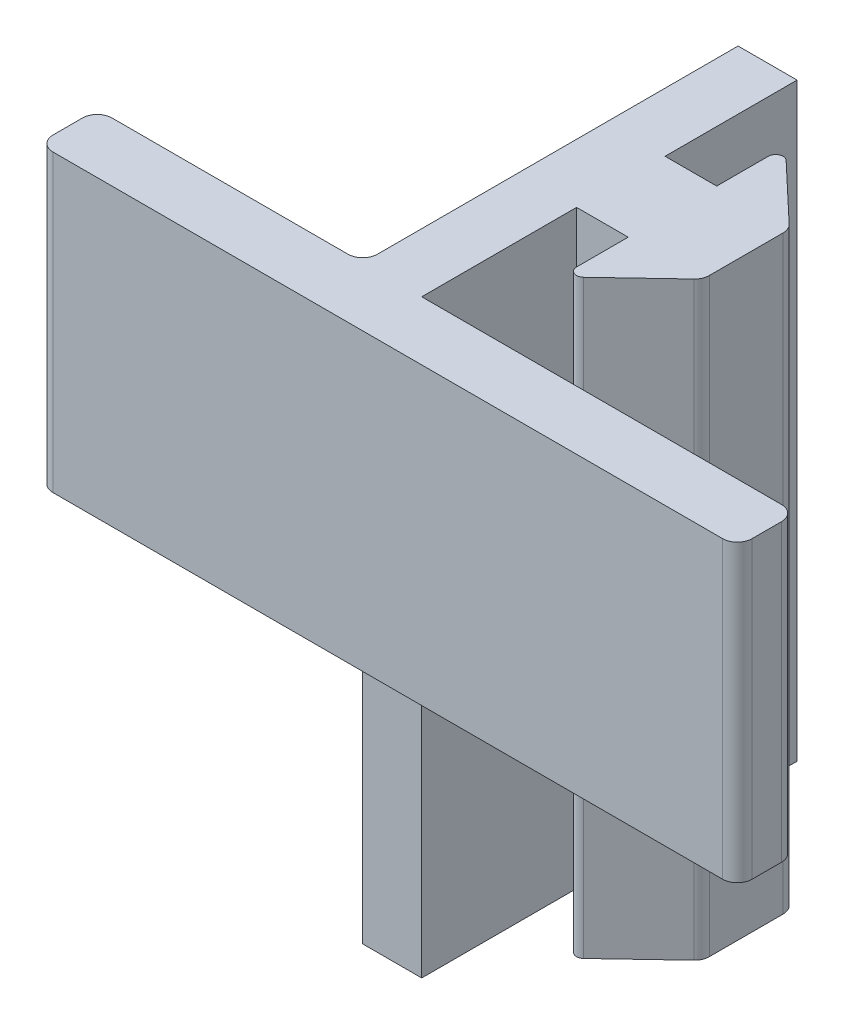
ISO-10303-21;
HEADER;
FILE_DESCRIPTION(('STEP AP214'),'2;1');
FILE_NAME('part.step','',(''),(''),'','','');
FILE_SCHEMA(('AUTOMOTIVE_DESIGN { 1 0 10303 214 1 1 1 1 }'));
ENDSEC;
DATA;
#1=APPLICATION_CONTEXT('core data for automotive mechanical design processes');
#2=APPLICATION_PROTOCOL_DEFINITION('international standard','automotive_design',2000,#1);
#3=PRODUCT_CONTEXT('',#1,'mechanical');
#4=PRODUCT('Part','Part','',(#3));
#5=PRODUCT_RELATED_PRODUCT_CATEGORY('part','',(#4));
#6=PRODUCT_DEFINITION_FORMATION('','',#4);
#7=PRODUCT_DEFINITION_CONTEXT('part definition',#1,'design');
#8=PRODUCT_DEFINITION('design','',#6,#7);
#9=PRODUCT_DEFINITION_SHAPE('','',#8);
#10=(LENGTH_UNIT() NAMED_UNIT(*) SI_UNIT(.MILLI.,.METRE.));
#11=(NAMED_UNIT(*) PLANE_ANGLE_UNIT() SI_UNIT($,.RADIAN.));
#12=(NAMED_UNIT(*) SI_UNIT($,.STERADIAN.) SOLID_ANGLE_UNIT());
#13=UNCERTAINTY_MEASURE_WITH_UNIT(LENGTH_MEASURE(1.E-05),#10,'distance_accuracy_value','');
#14=(GEOMETRIC_REPRESENTATION_CONTEXT(3) GLOBAL_UNCERTAINTY_ASSIGNED_CONTEXT((#13)) GLOBAL_UNIT_ASSIGNED_CONTEXT((#10,
#11,#12)) REPRESENTATION_CONTEXT('',''));
#15=CARTESIAN_POINT('',(0.,0.,0.));
#16=DIRECTION('',(0.,0.,1.));
#17=DIRECTION('',(1.,0.,0.));
#18=AXIS2_PLACEMENT_3D('',#15,#16,#17);
#19=CARTESIAN_POINT('',(28.4,40.,-0.659541062801933));
#20=DIRECTION('',(-1.,0.,0.));
#21=DIRECTION('',(0.,0.,1.));
#22=AXIS2_PLACEMENT_3D('',#19,#20,#21);
#23=PLANE('',#22);
#24=DIRECTION('',(0.,0.,1.));
#25=VECTOR('',#24,1.);
#26=CARTESIAN_POINT('',(28.4,20.,-0.659541062801928));
#27=LINE('',#26,#25);
#28=CARTESIAN_POINT('',(28.4,20.,0.340458937198067));
#29=VERTEX_POINT('',#28);
#30=CARTESIAN_POINT('',(28.4,20.,2.34045893719807));
#31=VERTEX_POINT('',#30);
#32=EDGE_CURVE('E238',#29,#31,#27,.T.);
#33=ORIENTED_EDGE('',*,*,#32,.F.);
#34=DIRECTION('',(0.,-1.,0.));
#35=VECTOR('',#34,1.);
#36=CARTESIAN_POINT('',(28.4,40.,0.340458937198068));
#37=LINE('',#36,#35);
#38=CARTESIAN_POINT('',(28.4,40.,0.340458937198068));
#39=VERTEX_POINT('',#38);
#40=EDGE_CURVE('E468',#29,#39,#37,.F.);
#41=ORIENTED_EDGE('',*,*,#40,.T.);
#42=DIRECTION('',(0.,0.,-1.));
#43=VECTOR('',#42,1.);
#44=CARTESIAN_POINT('',(28.4,40.,-0.659541062801933));
#45=LINE('',#44,#43);
#46=CARTESIAN_POINT('',(28.4,40.,2.34045893719807));
#47=VERTEX_POINT('',#46);
#48=EDGE_CURVE('E275',#47,#39,#45,.T.);
#49=ORIENTED_EDGE('',*,*,#48,.F.);
#50=DIRECTION('',(0.,-1.,0.));
#51=VECTOR('',#50,1.);
#52=CARTESIAN_POINT('',(28.4,40.,2.34045893719807));
#53=LINE('',#52,#51);
#54=EDGE_CURVE('E464',#47,#31,#53,.T.);
#55=ORIENTED_EDGE('',*,*,#54,.T.);
#56=EDGE_LOOP('',(#33,#41,#49,#55));
#57=FACE_BOUND('',#56,.T.);
#58=ADVANCED_FACE('F39',(#57),#23,.F.);
#59=CARTESIAN_POINT('',(3.,40.,-0.659541062801933));
#60=DIRECTION('',(0.,0.,1.));
#61=DIRECTION('',(1.,0.,0.));
#62=AXIS2_PLACEMENT_3D('',#59,#60,#61);
#63=PLANE('',#62);
#64=DIRECTION('',(1.,0.,0.));
#65=VECTOR('',#64,1.);
#66=CARTESIAN_POINT('',(3.,20.,-0.659541062801933));
#67=LINE('',#66,#65);
#68=CARTESIAN_POINT('',(3.,20.,-0.659541062801928));
#69=VERTEX_POINT('',#68);
#70=CARTESIAN_POINT('',(27.4,20.,-0.659541062801928));
#71=VERTEX_POINT('',#70);
#72=EDGE_CURVE('E271',#69,#71,#67,.T.);
#73=ORIENTED_EDGE('',*,*,#72,.F.);
#74=DIRECTION('',(0.,-1.,0.));
#75=VECTOR('',#74,1.);
#76=CARTESIAN_POINT('',(3.,40.,-0.659541062801933));
#77=LINE('',#76,#75);
#78=CARTESIAN_POINT('',(3.,40.,-0.659541062801933));
#79=VERTEX_POINT('',#78);
#80=EDGE_CURVE('E437',#79,#69,#77,.T.);
#81=ORIENTED_EDGE('',*,*,#80,.F.);
#82=DIRECTION('',(-1.,0.,0.));
#83=VECTOR('',#82,1.);
#84=CARTESIAN_POINT('',(3.,40.,-0.659541062801933));
#85=LINE('',#84,#83);
#86=CARTESIAN_POINT('',(27.4,40.,-0.659541062801933));
#87=VERTEX_POINT('',#86);
#88=EDGE_CURVE('E279',#87,#79,#85,.T.);
#89=ORIENTED_EDGE('',*,*,#88,.F.);
#90=DIRECTION('',(0.,-1.,0.));
#91=VECTOR('',#90,1.);
#92=CARTESIAN_POINT('',(27.4,40.,-0.659541062801933));
#93=LINE('',#92,#91);
#94=EDGE_CURVE('E460',#87,#71,#93,.T.);
#95=ORIENTED_EDGE('',*,*,#94,.T.);
#96=EDGE_LOOP('',(#73,#81,#89,#95));
#97=FACE_BOUND('',#96,.T.);
#98=ADVANCED_FACE('F510',(#97),#63,.F.);
#99=CARTESIAN_POINT('',(-1.,40.,-0.65954106280193));
#100=DIRECTION('',(0.,0.,1.));
#101=DIRECTION('',(1.,0.,0.));
#102=AXIS2_PLACEMENT_3D('',#99,#100,#101);
#103=PLANE('',#102);
#104=DIRECTION('',(1.,0.,0.));
#105=VECTOR('',#104,1.);
#106=CARTESIAN_POINT('',(-19.,20.,-0.659541062801928));
#107=LINE('',#106,#105);
#108=CARTESIAN_POINT('',(-18.,20.,-0.659541062801928));
#109=VERTEX_POINT('',#108);
#110=CARTESIAN_POINT('',(-2.,20.,-0.659541062801929));
#111=VERTEX_POINT('',#110);
#112=EDGE_CURVE('E54',#109,#111,#107,.T.);
#113=ORIENTED_EDGE('',*,*,#112,.F.);
#114=DIRECTION('',(0.,-1.,0.));
#115=VECTOR('',#114,1.);
#116=CARTESIAN_POINT('',(-18.,40.,-0.659541062801928));
#117=LINE('',#116,#115);
#118=CARTESIAN_POINT('',(-18.,40.,-0.659541062801928));
#119=VERTEX_POINT('',#118);
#120=EDGE_CURVE('E475',#109,#119,#117,.F.);
#121=ORIENTED_EDGE('',*,*,#120,.T.);
#122=DIRECTION('',(-1.,0.,0.));
#123=VECTOR('',#122,1.);
#124=CARTESIAN_POINT('',(-1.,40.,-0.65954106280193));
#125=LINE('',#124,#123);
#126=CARTESIAN_POINT('',(-2.,40.,-0.65954106280193));
#127=VERTEX_POINT('',#126);
#128=EDGE_CURVE('E327',#127,#119,#125,.T.);
#129=ORIENTED_EDGE('',*,*,#128,.F.);
#130=DIRECTION('',(0.,-1.,0.));
#131=VECTOR('',#130,1.);
#132=CARTESIAN_POINT('',(-2.,0.,-0.659541062801929));
#133=LINE('',#132,#131);
#134=EDGE_CURVE('E481',#127,#111,#133,.T.);
#135=ORIENTED_EDGE('',*,*,#134,.T.);
#136=EDGE_LOOP('',(#113,#121,#129,#135));
#137=FACE_BOUND('',#136,.T.);
#138=ADVANCED_FACE('F495',(#137),#103,.F.);
#139=CARTESIAN_POINT('',(-19.,40.,-0.659541062801928));
#140=DIRECTION('',(1.,0.,0.));
#141=DIRECTION('',(0.,0.,-1.));
#142=AXIS2_PLACEMENT_3D('',#139,#140,#141);
#143=PLANE('',#142);
#144=DIRECTION('',(0.,0.,-1.));
#145=VECTOR('',#144,1.);
#146=CARTESIAN_POINT('',(-19.,20.,-0.659541062801928));
#147=LINE('',#146,#145);
#148=CARTESIAN_POINT('',(-19.,20.,2.34045893719807));
#149=VERTEX_POINT('',#148);
#150=CARTESIAN_POINT('',(-19.,20.,0.340458937198072));
#151=VERTEX_POINT('',#150);
#152=EDGE_CURVE('E246',#149,#151,#147,.T.);
#153=ORIENTED_EDGE('',*,*,#152,.F.);
#154=DIRECTION('',(0.,-1.,0.));
#155=VECTOR('',#154,1.);
#156=CARTESIAN_POINT('',(-19.,40.,2.34045893719807));
#157=LINE('',#156,#155);
#158=CARTESIAN_POINT('',(-19.,40.,2.34045893719807));
#159=VERTEX_POINT('',#158);
#160=EDGE_CURVE('E448',#149,#159,#157,.F.);
#161=ORIENTED_EDGE('',*,*,#160,.T.);
#162=DIRECTION('',(0.,0.,1.));
#163=VECTOR('',#162,1.);
#164=CARTESIAN_POINT('',(-19.,40.,-0.659541062801928));
#165=LINE('',#164,#163);
#166=CARTESIAN_POINT('',(-19.,40.,0.340458937198072));
#167=VERTEX_POINT('',#166);
#168=EDGE_CURVE('E331',#167,#159,#165,.T.);
#169=ORIENTED_EDGE('',*,*,#168,.F.);
#170=DIRECTION('',(0.,-1.,0.));
#171=VECTOR('',#170,1.);
#172=CARTESIAN_POINT('',(-19.,40.,0.340458937198072));
#173=LINE('',#172,#171);
#174=EDGE_CURVE('E471',#167,#151,#173,.T.);
#175=ORIENTED_EDGE('',*,*,#174,.T.);
#176=EDGE_LOOP('',(#153,#161,#169,#175));
#177=FACE_BOUND('',#176,.T.);
#178=ADVANCED_FACE('F546',(#177),#143,.F.);
#179=CARTESIAN_POINT('',(-4.9999120167291,40.,3.34045893719807));
#180=DIRECTION('',(0.,0.,-1.));
#181=DIRECTION('',(-1.,0.,0.));
#182=AXIS2_PLACEMENT_3D('',#179,#180,#181);
#183=PLANE('',#182);
#184=DIRECTION('',(-1.,0.,0.));
#185=VECTOR('',#184,1.);
#186=CARTESIAN_POINT('',(-19.,20.,3.34045893719807));
#187=LINE('',#186,#185);
#188=CARTESIAN_POINT('',(27.4,20.,3.34045893719807));
#189=VERTEX_POINT('',#188);
#190=CARTESIAN_POINT('',(-18.,20.,3.34045893719807));
#191=VERTEX_POINT('',#190);
#192=EDGE_CURVE('E241',#189,#191,#187,.T.);
#193=ORIENTED_EDGE('',*,*,#192,.F.);
#194=DIRECTION('',(0.,-1.,0.));
#195=VECTOR('',#194,1.);
#196=CARTESIAN_POINT('',(27.4,40.,3.34045893719807));
#197=LINE('',#196,#195);
#198=CARTESIAN_POINT('',(27.4,40.,3.34045893719806));
#199=VERTEX_POINT('',#198);
#200=EDGE_CURVE('E441',#189,#199,#197,.F.);
#201=ORIENTED_EDGE('',*,*,#200,.T.);
#202=DIRECTION('',(1.,0.,0.));
#203=VECTOR('',#202,1.);
#204=CARTESIAN_POINT('',(-4.9999120167291,40.,3.34045893719807));
#205=LINE('',#204,#203);
#206=CARTESIAN_POINT('',(-18.,40.,3.34045893719807));
#207=VERTEX_POINT('',#206);
#208=EDGE_CURVE('E335',#207,#199,#205,.T.);
#209=ORIENTED_EDGE('',*,*,#208,.F.);
#210=DIRECTION('',(0.,-1.,0.));
#211=VECTOR('',#210,1.);
#212=CARTESIAN_POINT('',(-18.,40.,3.34045893719807));
#213=LINE('',#212,#211);
#214=EDGE_CURVE('E444',#207,#191,#213,.T.);
#215=ORIENTED_EDGE('',*,*,#214,.T.);
#216=EDGE_LOOP('',(#193,#201,#209,#215));
#217=FACE_BOUND('',#216,.T.);
#218=ADVANCED_FACE('F524',(#217),#183,.F.);
#219=CARTESIAN_POINT('',(-18.,40.,2.34045893719807));
#220=DIRECTION('',(0.,-1.,0.));
#221=DIRECTION('',(0.,0.,-1.));
#222=AXIS2_PLACEMENT_3D('',#219,#220,#221);
#223=CYLINDRICAL_SURFACE('',#222,1.);
#224=ORIENTED_EDGE('',*,*,#160,.F.);
#225=CARTESIAN_POINT('',(-18.,20.,2.34045893719807));
#226=DIRECTION('',(0.,-1.,0.));
#227=DIRECTION('',(0.,0.,-1.));
#228=AXIS2_PLACEMENT_3D('',#225,#226,#227);
#229=CIRCLE('',#228,1.);
#230=EDGE_CURVE('E267',#149,#191,#229,.F.);
#231=ORIENTED_EDGE('',*,*,#230,.T.);
#232=ORIENTED_EDGE('',*,*,#214,.F.);
#233=CARTESIAN_POINT('',(-18.,40.,2.34045893719807));
#234=DIRECTION('',(0.,1.,0.));
#235=DIRECTION('',(0.,0.,1.));
#236=AXIS2_PLACEMENT_3D('',#233,#234,#235);
#237=CIRCLE('',#236,1.);
#238=EDGE_CURVE('E457',#159,#207,#237,.T.);
#239=ORIENTED_EDGE('',*,*,#238,.F.);
#240=EDGE_LOOP('',(#224,#231,#232,#239));
#241=FACE_BOUND('',#240,.T.);
#242=ADVANCED_FACE('F520',(#241),#223,.T.);
#243=CARTESIAN_POINT('',(27.4,40.,0.340458937198067));
#244=DIRECTION('',(0.,-1.,0.));
#245=DIRECTION('',(0.,0.,-1.));
#246=AXIS2_PLACEMENT_3D('',#243,#244,#245);
#247=CYLINDRICAL_SURFACE('',#246,1.);
#248=ORIENTED_EDGE('',*,*,#40,.F.);
#249=CARTESIAN_POINT('',(27.4,20.,0.340458937198067));
#250=DIRECTION('',(0.,-1.,0.));
#251=DIRECTION('',(0.,0.,-1.));
#252=AXIS2_PLACEMENT_3D('',#249,#250,#251);
#253=CIRCLE('',#252,1.);
#254=EDGE_CURVE('E263',#29,#71,#253,.F.);
#255=ORIENTED_EDGE('',*,*,#254,.T.);
#256=ORIENTED_EDGE('',*,*,#94,.F.);
#257=CARTESIAN_POINT('',(27.4,40.,0.340458937198067));
#258=DIRECTION('',(0.,1.,0.));
#259=DIRECTION('',(0.,0.,1.));
#260=AXIS2_PLACEMENT_3D('',#257,#258,#259);
#261=CIRCLE('',#260,1.);
#262=EDGE_CURVE('E454',#39,#87,#261,.T.);
#263=ORIENTED_EDGE('',*,*,#262,.F.);
#264=EDGE_LOOP('',(#248,#255,#256,#263));
#265=FACE_BOUND('',#264,.T.);
#266=ADVANCED_FACE('F523',(#265),#247,.T.);
#267=CARTESIAN_POINT('',(27.4,40.,2.34045893719807));
#268=DIRECTION('',(0.,-1.,0.));
#269=DIRECTION('',(0.,0.,-1.));
#270=AXIS2_PLACEMENT_3D('',#267,#268,#269);
#271=CYLINDRICAL_SURFACE('',#270,1.);
#272=ORIENTED_EDGE('',*,*,#200,.F.);
#273=CARTESIAN_POINT('',(27.4,20.,2.34045893719807));
#274=DIRECTION('',(0.,-1.,0.));
#275=DIRECTION('',(0.,0.,-1.));
#276=AXIS2_PLACEMENT_3D('',#273,#274,#275);
#277=CIRCLE('',#276,1.);
#278=EDGE_CURVE('E259',#189,#31,#277,.F.);
#279=ORIENTED_EDGE('',*,*,#278,.T.);
#280=ORIENTED_EDGE('',*,*,#54,.F.);
#281=CARTESIAN_POINT('',(27.4,40.,2.34045893719807));
#282=DIRECTION('',(0.,1.,0.));
#283=DIRECTION('',(0.,0.,1.));
#284=AXIS2_PLACEMENT_3D('',#281,#282,#283);
#285=CIRCLE('',#284,1.);
#286=EDGE_CURVE('E451',#199,#47,#285,.T.);
#287=ORIENTED_EDGE('',*,*,#286,.F.);
#288=EDGE_LOOP('',(#272,#279,#280,#287));
#289=FACE_BOUND('',#288,.T.);
#290=ADVANCED_FACE('F507',(#289),#271,.T.);
#291=CARTESIAN_POINT('',(-18.,40.,0.340458937198072));
#292=DIRECTION('',(0.,-1.,0.));
#293=DIRECTION('',(0.,0.,-1.));
#294=AXIS2_PLACEMENT_3D('',#291,#292,#293);
#295=CYLINDRICAL_SURFACE('',#294,1.);
#296=ORIENTED_EDGE('',*,*,#120,.F.);
#297=CARTESIAN_POINT('',(-18.,20.,0.340458937198072));
#298=DIRECTION('',(0.,-1.,0.));
#299=DIRECTION('',(0.,0.,-1.));
#300=AXIS2_PLACEMENT_3D('',#297,#298,#299);
#301=CIRCLE('',#300,1.);
#302=EDGE_CURVE('E254',#109,#151,#301,.F.);
#303=ORIENTED_EDGE('',*,*,#302,.T.);
#304=ORIENTED_EDGE('',*,*,#174,.F.);
#305=CARTESIAN_POINT('',(-18.,40.,0.340458937198072));
#306=DIRECTION('',(0.,1.,0.));
#307=DIRECTION('',(0.,0.,1.));
#308=AXIS2_PLACEMENT_3D('',#305,#306,#307);
#309=CIRCLE('',#308,1.);
#310=EDGE_CURVE('E478',#119,#167,#309,.T.);
#311=ORIENTED_EDGE('',*,*,#310,.F.);
#312=EDGE_LOOP('',(#296,#303,#304,#311));
#313=FACE_BOUND('',#312,.T.);
#314=ADVANCED_FACE('F499',(#313),#295,.T.);
#315=CARTESIAN_POINT('',(-2.,40.,-1.65954106280193));
#316=DIRECTION('',(0.,1.,0.));
#317=DIRECTION('',(0.,0.,1.));
#318=AXIS2_PLACEMENT_3D('',#315,#316,#317);
#319=CYLINDRICAL_SURFACE('',#318,1.);
#320=CARTESIAN_POINT('',(-2.,20.,-1.65954106280193));
#321=DIRECTION('',(0.,-1.,0.));
#322=DIRECTION('',(0.,0.,-1.));
#323=AXIS2_PLACEMENT_3D('',#320,#321,#322);
#324=CIRCLE('',#323,1.);
#325=CARTESIAN_POINT('',(-1.,20.,-1.65954106280193));
#326=VERTEX_POINT('',#325);
#327=EDGE_CURVE('E11',#111,#326,#324,.F.);
#328=ORIENTED_EDGE('',*,*,#327,.F.);
#329=ORIENTED_EDGE('',*,*,#134,.F.);
#330=CARTESIAN_POINT('',(-2.,40.,-1.65954106280193));
#331=DIRECTION('',(0.,1.,0.));
#332=DIRECTION('',(0.,0.,1.));
#333=AXIS2_PLACEMENT_3D('',#330,#331,#332);
#334=CIRCLE('',#333,1.);
#335=CARTESIAN_POINT('',(-1.,40.,-1.65954106280193));
#336=VERTEX_POINT('',#335);
#337=EDGE_CURVE('E48',#336,#127,#334,.F.);
#338=ORIENTED_EDGE('',*,*,#337,.F.);
#339=DIRECTION('',(0.,-1.,0.));
#340=VECTOR('',#339,1.);
#341=CARTESIAN_POINT('',(-1.,40.,-1.65954106280193));
#342=LINE('',#341,#340);
#343=EDGE_CURVE('E62',#326,#336,#342,.F.);
#344=ORIENTED_EDGE('',*,*,#343,.F.);
#345=EDGE_LOOP('',(#328,#329,#338,#344));
#346=FACE_BOUND('',#345,.T.);
#347=ADVANCED_FACE('F41',(#346),#319,.F.);
#348=CARTESIAN_POINT('',(3.,40.,-0.659541062801933));
#349=DIRECTION('',(-1.,0.,0.));
#350=DIRECTION('',(0.,0.,1.));
#351=AXIS2_PLACEMENT_3D('',#348,#349,#350);
#352=PLANE('',#351);
#353=DIRECTION('',(0.,0.,-1.));
#354=VECTOR('',#353,1.);
#355=CARTESIAN_POINT('',(3.,0.,-0.659541062801933));
#356=LINE('',#355,#354);
#357=CARTESIAN_POINT('',(3.,0.,-0.659541062801928));
#358=VERTEX_POINT('',#357);
#359=CARTESIAN_POINT('',(3.,0.,-11.1595410628019));
#360=VERTEX_POINT('',#359);
#361=EDGE_CURVE('E274',#358,#360,#356,.T.);
#362=ORIENTED_EDGE('',*,*,#361,.T.);
#363=DIRECTION('',(0.,-1.,0.));
#364=VECTOR('',#363,1.);
#365=CARTESIAN_POINT('',(3.,40.,-11.1595410628019));
#366=LINE('',#365,#364);
#367=CARTESIAN_POINT('',(3.,40.,-11.1595410628019));
#368=VERTEX_POINT('',#367);
#369=EDGE_CURVE('E433',#368,#360,#366,.T.);
#370=ORIENTED_EDGE('',*,*,#369,.F.);
#371=DIRECTION('',(0.,0.,-1.));
#372=VECTOR('',#371,1.);
#373=CARTESIAN_POINT('',(3.,40.,-0.659541062801933));
#374=LINE('',#373,#372);
#375=EDGE_CURVE('E282',#79,#368,#374,.T.);
#376=ORIENTED_EDGE('',*,*,#375,.F.);
#377=ORIENTED_EDGE('',*,*,#80,.T.);
#378=DIRECTION('',(0.,-1.,0.));
#379=VECTOR('',#378,1.);
#380=CARTESIAN_POINT('',(3.,20.,-0.659541062801928));
#381=LINE('',#380,#379);
#382=EDGE_CURVE('E233',#69,#358,#381,.T.);
#383=ORIENTED_EDGE('',*,*,#382,.T.);
#384=EDGE_LOOP('',(#362,#370,#376,#377,#383));
#385=FACE_BOUND('',#384,.T.);
#386=ADVANCED_FACE('F498',(#385),#352,.F.);
#387=CARTESIAN_POINT('',(3.,40.,-11.1595410628019));
#388=DIRECTION('',(0.,0.,-1.));
#389=DIRECTION('',(-1.,0.,0.));
#390=AXIS2_PLACEMENT_3D('',#387,#388,#389);
#391=PLANE('',#390);
#392=DIRECTION('',(1.,0.,0.));
#393=VECTOR('',#392,1.);
#394=CARTESIAN_POINT('',(3.,0.,-11.1595410628019));
#395=LINE('',#394,#393);
#396=CARTESIAN_POINT('',(6.5,0.,-11.1595410628019));
#397=VERTEX_POINT('',#396);
#398=EDGE_CURVE('E342',#360,#397,#395,.T.);
#399=ORIENTED_EDGE('',*,*,#398,.T.);
#400=DIRECTION('',(0.,-1.,0.));
#401=VECTOR('',#400,1.);
#402=CARTESIAN_POINT('',(6.5,40.,-11.1595410628019));
#403=LINE('',#402,#401);
#404=CARTESIAN_POINT('',(6.5,40.,-11.1595410628019));
#405=VERTEX_POINT('',#404);
#406=EDGE_CURVE('E429',#405,#397,#403,.T.);
#407=ORIENTED_EDGE('',*,*,#406,.F.);
#408=DIRECTION('',(1.,0.,0.));
#409=VECTOR('',#408,1.);
#410=CARTESIAN_POINT('',(3.,40.,-11.1595410628019));
#411=LINE('',#410,#409);
#412=EDGE_CURVE('E285',#368,#405,#411,.T.);
#413=ORIENTED_EDGE('',*,*,#412,.F.);
#414=ORIENTED_EDGE('',*,*,#369,.T.);
#415=EDGE_LOOP('',(#399,#407,#413,#414));
#416=FACE_BOUND('',#415,.T.);
#417=ADVANCED_FACE('F504',(#416),#391,.F.);
#418=CARTESIAN_POINT('',(6.5,40.,-11.1595410628019));
#419=DIRECTION('',(1.,0.,0.));
#420=DIRECTION('',(0.,0.,-1.));
#421=AXIS2_PLACEMENT_3D('',#418,#419,#420);
#422=PLANE('',#421);
#423=DIRECTION('',(0.,0.,1.));
#424=VECTOR('',#423,1.);
#425=CARTESIAN_POINT('',(6.5,0.,-11.1595410628019));
#426=LINE('',#425,#424);
#427=CARTESIAN_POINT('',(6.5,0.,-7.65954106280193));
#428=VERTEX_POINT('',#427);
#429=EDGE_CURVE('E345',#397,#428,#426,.T.);
#430=ORIENTED_EDGE('',*,*,#429,.T.);
#431=DIRECTION('',(0.,-1.,0.));
#432=VECTOR('',#431,1.);
#433=CARTESIAN_POINT('',(6.5,40.,-7.65954106280193));
#434=LINE('',#433,#432);
#435=CARTESIAN_POINT('',(6.5,40.,-7.65954106280193));
#436=VERTEX_POINT('',#435);
#437=EDGE_CURVE('E425',#436,#428,#434,.T.);
#438=ORIENTED_EDGE('',*,*,#437,.F.);
#439=DIRECTION('',(0.,0.,1.));
#440=VECTOR('',#439,1.);
#441=CARTESIAN_POINT('',(6.5,40.,-11.1595410628019));
#442=LINE('',#441,#440);
#443=EDGE_CURVE('E288',#405,#436,#442,.T.);
#444=ORIENTED_EDGE('',*,*,#443,.F.);
#445=ORIENTED_EDGE('',*,*,#406,.T.);
#446=EDGE_LOOP('',(#430,#438,#444,#445));
#447=FACE_BOUND('',#446,.T.);
#448=ADVANCED_FACE('F603',(#447),#422,.F.);
#449=CARTESIAN_POINT('',(7.,40.,-7.65954106280193));
#450=DIRECTION('',(0.,-1.,0.));
#451=DIRECTION('',(0.,0.,-1.));
#452=AXIS2_PLACEMENT_3D('',#449,#450,#451);
#453=CYLINDRICAL_SURFACE('',#452,0.499999999999999);
#454=CARTESIAN_POINT('',(7.,0.,-7.65954106280193));
#455=DIRECTION('',(0.,1.,0.));
#456=DIRECTION('',(0.,0.,1.));
#457=AXIS2_PLACEMENT_3D('',#454,#455,#456);
#458=CIRCLE('',#457,0.499999999999999);
#459=CARTESIAN_POINT('',(7.34364620333658,0.,-7.29635063488242));
#460=VERTEX_POINT('',#459);
#461=EDGE_CURVE('E348',#428,#460,#458,.T.);
#462=ORIENTED_EDGE('',*,*,#461,.T.);
#463=DIRECTION('',(0.,-1.,0.));
#464=VECTOR('',#463,1.);
#465=CARTESIAN_POINT('',(7.34364620333658,40.,-7.29635063488242));
#466=LINE('',#465,#464);
#467=CARTESIAN_POINT('',(7.34364620333658,40.,-7.29635063488242));
#468=VERTEX_POINT('',#467);
#469=EDGE_CURVE('E421',#468,#460,#466,.T.);
#470=ORIENTED_EDGE('',*,*,#469,.F.);
#471=CARTESIAN_POINT('',(7.,40.,-7.65954106280193));
#472=DIRECTION('',(0.,1.,0.));
#473=DIRECTION('',(0.,0.,1.));
#474=AXIS2_PLACEMENT_3D('',#471,#472,#473);
#475=CIRCLE('',#474,0.499999999999999);
#476=EDGE_CURVE('E291',#436,#468,#475,.T.);
#477=ORIENTED_EDGE('',*,*,#476,.F.);
#478=ORIENTED_EDGE('',*,*,#437,.T.);
#479=EDGE_LOOP('',(#462,#470,#477,#478));
#480=FACE_BOUND('',#479,.T.);
#481=ADVANCED_FACE('F599',(#480),#453,.T.);
#482=CARTESIAN_POINT('',(7.34364620333658,40.,-7.29635063488242));
#483=DIRECTION('',(-0.687292406673158,0.,-0.726380855839014));
#484=DIRECTION('',(-0.726380855839014,0.,0.687292406673158));
#485=AXIS2_PLACEMENT_3D('',#482,#483,#484);
#486=PLANE('',#485);
#487=DIRECTION('',(0.726380855839014,0.,-0.687292406673158));
#488=VECTOR('',#487,1.);
#489=CARTESIAN_POINT('',(7.34364620333658,0.,-7.29635063488242));
#490=LINE('',#489,#488);
#491=CARTESIAN_POINT('',(11.1872924066732,0.,-10.9331602069629));
#492=VERTEX_POINT('',#491);
#493=EDGE_CURVE('E351',#460,#492,#490,.T.);
#494=ORIENTED_EDGE('',*,*,#493,.T.);
#495=DIRECTION('',(0.,-1.,0.));
#496=VECTOR('',#495,1.);
#497=CARTESIAN_POINT('',(11.1872924066732,40.,-10.9331602069629));
#498=LINE('',#497,#496);
#499=CARTESIAN_POINT('',(11.1872924066732,40.,-10.9331602069629));
#500=VERTEX_POINT('',#499);
#501=EDGE_CURVE('E417',#500,#492,#498,.T.);
#502=ORIENTED_EDGE('',*,*,#501,.F.);
#503=DIRECTION('',(0.726380855839014,0.,-0.687292406673158));
#504=VECTOR('',#503,1.);
#505=CARTESIAN_POINT('',(7.34364620333658,40.,-7.29635063488242));
#506=LINE('',#505,#504);
#507=EDGE_CURVE('E294',#468,#500,#506,.T.);
#508=ORIENTED_EDGE('',*,*,#507,.F.);
#509=ORIENTED_EDGE('',*,*,#469,.T.);
#510=EDGE_LOOP('',(#494,#502,#508,#509));
#511=FACE_BOUND('',#510,.T.);
#512=ADVANCED_FACE('F595',(#511),#486,.F.);
#513=CARTESIAN_POINT('',(10.5,40.,-11.6595410628019));
#514=DIRECTION('',(0.,-1.,0.));
#515=DIRECTION('',(0.,0.,-1.));
#516=AXIS2_PLACEMENT_3D('',#513,#514,#515);
#517=CYLINDRICAL_SURFACE('',#516,0.999999999999999);
#518=CARTESIAN_POINT('',(10.5,0.,-11.6595410628019));
#519=DIRECTION('',(0.,1.,0.));
#520=DIRECTION('',(0.,0.,1.));
#521=AXIS2_PLACEMENT_3D('',#518,#519,#520);
#522=CIRCLE('',#521,0.999999999999999);
#523=CARTESIAN_POINT('',(11.5,0.,-11.6595410628019));
#524=VERTEX_POINT('',#523);
#525=EDGE_CURVE('E354',#492,#524,#522,.T.);
#526=ORIENTED_EDGE('',*,*,#525,.T.);
#527=DIRECTION('',(0.,-1.,0.));
#528=VECTOR('',#527,1.);
#529=CARTESIAN_POINT('',(11.5,40.,-11.6595410628019));
#530=LINE('',#529,#528);
#531=CARTESIAN_POINT('',(11.5,40.,-11.6595410628019));
#532=VERTEX_POINT('',#531);
#533=EDGE_CURVE('E413',#532,#524,#530,.T.);
#534=ORIENTED_EDGE('',*,*,#533,.F.);
#535=CARTESIAN_POINT('',(10.5,40.,-11.6595410628019));
#536=DIRECTION('',(0.,1.,0.));
#537=DIRECTION('',(0.,0.,1.));
#538=AXIS2_PLACEMENT_3D('',#535,#536,#537);
#539=CIRCLE('',#538,0.999999999999999);
#540=EDGE_CURVE('E297',#500,#532,#539,.T.);
#541=ORIENTED_EDGE('',*,*,#540,.F.);
#542=ORIENTED_EDGE('',*,*,#501,.T.);
#543=EDGE_LOOP('',(#526,#534,#541,#542));
#544=FACE_BOUND('',#543,.T.);
#545=ADVANCED_FACE('F591',(#544),#517,.T.);
#546=CARTESIAN_POINT('',(11.5,40.,-16.6595410628019));
#547=DIRECTION('',(-1.,0.,0.));
#548=DIRECTION('',(0.,0.,1.));
#549=AXIS2_PLACEMENT_3D('',#546,#547,#548);
#550=PLANE('',#549);
#551=DIRECTION('',(0.,0.,-1.));
#552=VECTOR('',#551,1.);
#553=CARTESIAN_POINT('',(11.5,0.,-16.6595410628019));
#554=LINE('',#553,#552);
#555=CARTESIAN_POINT('',(11.5,0.,-16.6595410628019));
#556=VERTEX_POINT('',#555);
#557=EDGE_CURVE('E357',#524,#556,#554,.T.);
#558=ORIENTED_EDGE('',*,*,#557,.T.);
#559=DIRECTION('',(0.,-1.,0.));
#560=VECTOR('',#559,1.);
#561=CARTESIAN_POINT('',(11.5,40.,-16.6595410628019));
#562=LINE('',#561,#560);
#563=CARTESIAN_POINT('',(11.5,40.,-16.6595410628019));
#564=VERTEX_POINT('',#563);
#565=EDGE_CURVE('E409',#564,#556,#562,.T.);
#566=ORIENTED_EDGE('',*,*,#565,.F.);
#567=DIRECTION('',(0.,0.,-1.));
#568=VECTOR('',#567,1.);
#569=CARTESIAN_POINT('',(11.5,40.,-16.6595410628019));
#570=LINE('',#569,#568);
#571=EDGE_CURVE('E300',#532,#564,#570,.T.);
#572=ORIENTED_EDGE('',*,*,#571,.F.);
#573=ORIENTED_EDGE('',*,*,#533,.T.);
#574=EDGE_LOOP('',(#558,#566,#572,#573));
#575=FACE_BOUND('',#574,.T.);
#576=ADVANCED_FACE('F587',(#575),#550,.F.);
#577=CARTESIAN_POINT('',(10.5,40.,-16.6595410628019));
#578=DIRECTION('',(0.,-1.,0.));
#579=DIRECTION('',(0.,0.,-1.));
#580=AXIS2_PLACEMENT_3D('',#577,#578,#579);
#581=CYLINDRICAL_SURFACE('',#580,1.);
#582=CARTESIAN_POINT('',(10.5,0.,-16.6595410628019));
#583=DIRECTION('',(0.,1.,0.));
#584=DIRECTION('',(0.,0.,-1.));
#585=AXIS2_PLACEMENT_3D('',#582,#583,#584);
#586=CIRCLE('',#585,1.);
#587=CARTESIAN_POINT('',(11.1872924066732,0.,-17.3859219186409));
#588=VERTEX_POINT('',#587);
#589=EDGE_CURVE('E360',#556,#588,#586,.T.);
#590=ORIENTED_EDGE('',*,*,#589,.T.);
#591=DIRECTION('',(0.,-1.,0.));
#592=VECTOR('',#591,1.);
#593=CARTESIAN_POINT('',(11.1872924066732,40.,-17.3859219186409));
#594=LINE('',#593,#592);
#595=CARTESIAN_POINT('',(11.1872924066732,40.,-17.3859219186409));
#596=VERTEX_POINT('',#595);
#597=EDGE_CURVE('E405',#596,#588,#594,.T.);
#598=ORIENTED_EDGE('',*,*,#597,.F.);
#599=CARTESIAN_POINT('',(10.5,40.,-16.6595410628019));
#600=DIRECTION('',(0.,1.,0.));
#601=DIRECTION('',(0.,0.,-1.));
#602=AXIS2_PLACEMENT_3D('',#599,#600,#601);
#603=CIRCLE('',#602,1.);
#604=EDGE_CURVE('E303',#564,#596,#603,.T.);
#605=ORIENTED_EDGE('',*,*,#604,.F.);
#606=ORIENTED_EDGE('',*,*,#565,.T.);
#607=EDGE_LOOP('',(#590,#598,#605,#606));
#608=FACE_BOUND('',#607,.T.);
#609=ADVANCED_FACE('F583',(#608),#581,.T.);
#610=CARTESIAN_POINT('',(7.34364620333657,40.,-21.0227314907214));
#611=DIRECTION('',(-0.687292406673158,0.,0.726380855839014));
#612=DIRECTION('',(0.726380855839014,0.,0.687292406673158));
#613=AXIS2_PLACEMENT_3D('',#610,#611,#612);
#614=PLANE('',#613);
#615=DIRECTION('',(-0.726380855839014,0.,-0.687292406673158));
#616=VECTOR('',#615,1.);
#617=CARTESIAN_POINT('',(7.34364620333657,0.,-21.0227314907214));
#618=LINE('',#617,#616);
#619=CARTESIAN_POINT('',(7.34364620333657,0.,-21.0227314907214));
#620=VERTEX_POINT('',#619);
#621=EDGE_CURVE('E363',#588,#620,#618,.T.);
#622=ORIENTED_EDGE('',*,*,#621,.T.);
#623=DIRECTION('',(0.,-1.,0.));
#624=VECTOR('',#623,1.);
#625=CARTESIAN_POINT('',(7.34364620333657,40.,-21.0227314907214));
#626=LINE('',#625,#624);
#627=CARTESIAN_POINT('',(7.34364620333657,40.,-21.0227314907214));
#628=VERTEX_POINT('',#627);
#629=EDGE_CURVE('E401',#628,#620,#626,.T.);
#630=ORIENTED_EDGE('',*,*,#629,.F.);
#631=DIRECTION('',(-0.726380855839014,0.,-0.687292406673158));
#632=VECTOR('',#631,1.);
#633=CARTESIAN_POINT('',(7.34364620333657,40.,-21.0227314907214));
#634=LINE('',#633,#632);
#635=EDGE_CURVE('E306',#596,#628,#634,.T.);
#636=ORIENTED_EDGE('',*,*,#635,.F.);
#637=ORIENTED_EDGE('',*,*,#597,.T.);
#638=EDGE_LOOP('',(#622,#630,#636,#637));
#639=FACE_BOUND('',#638,.T.);
#640=ADVANCED_FACE('F579',(#639),#614,.F.);
#641=CARTESIAN_POINT('',(7.,40.,-20.6595410628019));
#642=DIRECTION('',(0.,-1.,0.));
#643=DIRECTION('',(0.,0.,-1.));
#644=AXIS2_PLACEMENT_3D('',#641,#642,#643);
#645=CYLINDRICAL_SURFACE('',#644,0.499999999999998);
#646=CARTESIAN_POINT('',(7.,0.,-20.6595410628019));
#647=DIRECTION('',(0.,1.,0.));
#648=DIRECTION('',(0.,0.,1.));
#649=AXIS2_PLACEMENT_3D('',#646,#647,#648);
#650=CIRCLE('',#649,0.499999999999998);
#651=CARTESIAN_POINT('',(6.5,0.,-20.6595410628019));
#652=VERTEX_POINT('',#651);
#653=EDGE_CURVE('E366',#620,#652,#650,.T.);
#654=ORIENTED_EDGE('',*,*,#653,.T.);
#655=DIRECTION('',(0.,-1.,0.));
#656=VECTOR('',#655,1.);
#657=CARTESIAN_POINT('',(6.5,40.,-20.6595410628019));
#658=LINE('',#657,#656);
#659=CARTESIAN_POINT('',(6.5,40.,-20.6595410628019));
#660=VERTEX_POINT('',#659);
#661=EDGE_CURVE('E397',#660,#652,#658,.T.);
#662=ORIENTED_EDGE('',*,*,#661,.F.);
#663=CARTESIAN_POINT('',(7.,40.,-20.6595410628019));
#664=DIRECTION('',(0.,1.,0.));
#665=DIRECTION('',(0.,0.,1.));
#666=AXIS2_PLACEMENT_3D('',#663,#664,#665);
#667=CIRCLE('',#666,0.499999999999998);
#668=EDGE_CURVE('E309',#628,#660,#667,.T.);
#669=ORIENTED_EDGE('',*,*,#668,.F.);
#670=ORIENTED_EDGE('',*,*,#629,.T.);
#671=EDGE_LOOP('',(#654,#662,#669,#670));
#672=FACE_BOUND('',#671,.T.);
#673=ADVANCED_FACE('F575',(#672),#645,.T.);
#674=CARTESIAN_POINT('',(6.5,40.,-20.6595410628019));
#675=DIRECTION('',(1.,0.,0.));
#676=DIRECTION('',(0.,0.,-1.));
#677=AXIS2_PLACEMENT_3D('',#674,#675,#676);
#678=PLANE('',#677);
#679=DIRECTION('',(0.,0.,1.));
#680=VECTOR('',#679,1.);
#681=CARTESIAN_POINT('',(6.5,0.,-20.6595410628019));
#682=LINE('',#681,#680);
#683=CARTESIAN_POINT('',(6.5,0.,-17.1595410628019));
#684=VERTEX_POINT('',#683);
#685=EDGE_CURVE('E369',#652,#684,#682,.T.);
#686=ORIENTED_EDGE('',*,*,#685,.T.);
#687=DIRECTION('',(0.,-1.,0.));
#688=VECTOR('',#687,1.);
#689=CARTESIAN_POINT('',(6.5,40.,-17.1595410628019));
#690=LINE('',#689,#688);
#691=CARTESIAN_POINT('',(6.5,40.,-17.1595410628019));
#692=VERTEX_POINT('',#691);
#693=EDGE_CURVE('E393',#692,#684,#690,.T.);
#694=ORIENTED_EDGE('',*,*,#693,.F.);
#695=DIRECTION('',(0.,0.,1.));
#696=VECTOR('',#695,1.);
#697=CARTESIAN_POINT('',(6.5,40.,-20.6595410628019));
#698=LINE('',#697,#696);
#699=EDGE_CURVE('E312',#660,#692,#698,.T.);
#700=ORIENTED_EDGE('',*,*,#699,.F.);
#701=ORIENTED_EDGE('',*,*,#661,.T.);
#702=EDGE_LOOP('',(#686,#694,#700,#701));
#703=FACE_BOUND('',#702,.T.);
#704=ADVANCED_FACE('F571',(#703),#678,.F.);
#705=CARTESIAN_POINT('',(3.,40.,-17.1595410628019));
#706=DIRECTION('',(0.,0.,1.));
#707=DIRECTION('',(1.,0.,0.));
#708=AXIS2_PLACEMENT_3D('',#705,#706,#707);
#709=PLANE('',#708);
#710=DIRECTION('',(-1.,0.,0.));
#711=VECTOR('',#710,1.);
#712=CARTESIAN_POINT('',(3.,0.,-17.1595410628019));
#713=LINE('',#712,#711);
#714=CARTESIAN_POINT('',(3.,0.,-17.1595410628019));
#715=VERTEX_POINT('',#714);
#716=EDGE_CURVE('E372',#684,#715,#713,.T.);
#717=ORIENTED_EDGE('',*,*,#716,.T.);
#718=DIRECTION('',(0.,-1.,0.));
#719=VECTOR('',#718,1.);
#720=CARTESIAN_POINT('',(3.,40.,-17.1595410628019));
#721=LINE('',#720,#719);
#722=CARTESIAN_POINT('',(3.,40.,-17.1595410628019));
#723=VERTEX_POINT('',#722);
#724=EDGE_CURVE('E389',#723,#715,#721,.T.);
#725=ORIENTED_EDGE('',*,*,#724,.F.);
#726=DIRECTION('',(-1.,0.,0.));
#727=VECTOR('',#726,1.);
#728=CARTESIAN_POINT('',(3.,40.,-17.1595410628019));
#729=LINE('',#728,#727);
#730=EDGE_CURVE('E315',#692,#723,#729,.T.);
#731=ORIENTED_EDGE('',*,*,#730,.F.);
#732=ORIENTED_EDGE('',*,*,#693,.T.);
#733=EDGE_LOOP('',(#717,#725,#731,#732));
#734=FACE_BOUND('',#733,.T.);
#735=ADVANCED_FACE('F567',(#734),#709,.F.);
#736=CARTESIAN_POINT('',(3.,40.,-17.1595410628019));
#737=DIRECTION('',(-1.,0.,0.));
#738=DIRECTION('',(0.,0.,1.));
#739=AXIS2_PLACEMENT_3D('',#736,#737,#738);
#740=PLANE('',#739);
#741=DIRECTION('',(0.,0.,-1.));
#742=VECTOR('',#741,1.);
#743=CARTESIAN_POINT('',(3.,0.,-17.1595410628019));
#744=LINE('',#743,#742);
#745=CARTESIAN_POINT('',(3.,0.,-26.1095410628019));
#746=VERTEX_POINT('',#745);
#747=EDGE_CURVE('E375',#715,#746,#744,.T.);
#748=ORIENTED_EDGE('',*,*,#747,.T.);
#749=DIRECTION('',(0.,-1.,0.));
#750=VECTOR('',#749,1.);
#751=CARTESIAN_POINT('',(3.,40.,-26.1095410628019));
#752=LINE('',#751,#750);
#753=CARTESIAN_POINT('',(3.,40.,-26.1095410628019));
#754=VERTEX_POINT('',#753);
#755=EDGE_CURVE('E385',#754,#746,#752,.T.);
#756=ORIENTED_EDGE('',*,*,#755,.F.);
#757=DIRECTION('',(0.,0.,-1.));
#758=VECTOR('',#757,1.);
#759=CARTESIAN_POINT('',(3.,40.,-17.1595410628019));
#760=LINE('',#759,#758);
#761=EDGE_CURVE('E318',#723,#754,#760,.T.);
#762=ORIENTED_EDGE('',*,*,#761,.F.);
#763=ORIENTED_EDGE('',*,*,#724,.T.);
#764=EDGE_LOOP('',(#748,#756,#762,#763));
#765=FACE_BOUND('',#764,.T.);
#766=ADVANCED_FACE('F563',(#765),#740,.F.);
#767=CARTESIAN_POINT('',(-1.,40.,-26.1095410628019));
#768=DIRECTION('',(0.,0.,1.));
#769=DIRECTION('',(1.,0.,0.));
#770=AXIS2_PLACEMENT_3D('',#767,#768,#769);
#771=PLANE('',#770);
#772=DIRECTION('',(-1.,0.,0.));
#773=VECTOR('',#772,1.);
#774=CARTESIAN_POINT('',(-1.,0.,-26.1095410628019));
#775=LINE('',#774,#773);
#776=CARTESIAN_POINT('',(-1.,0.,-26.1095410628019));
#777=VERTEX_POINT('',#776);
#778=EDGE_CURVE('E378',#746,#777,#775,.T.);
#779=ORIENTED_EDGE('',*,*,#778,.T.);
#780=DIRECTION('',(0.,-1.,0.));
#781=VECTOR('',#780,1.);
#782=CARTESIAN_POINT('',(-1.,40.,-26.1095410628019));
#783=LINE('',#782,#781);
#784=CARTESIAN_POINT('',(-1.,40.,-26.1095410628019));
#785=VERTEX_POINT('',#784);
#786=EDGE_CURVE('E339',#785,#777,#783,.T.);
#787=ORIENTED_EDGE('',*,*,#786,.F.);
#788=DIRECTION('',(-1.,0.,0.));
#789=VECTOR('',#788,1.);
#790=CARTESIAN_POINT('',(-1.,40.,-26.1095410628019));
#791=LINE('',#790,#789);
#792=EDGE_CURVE('E321',#754,#785,#791,.T.);
#793=ORIENTED_EDGE('',*,*,#792,.F.);
#794=ORIENTED_EDGE('',*,*,#755,.T.);
#795=EDGE_LOOP('',(#779,#787,#793,#794));
#796=FACE_BOUND('',#795,.T.);
#797=ADVANCED_FACE('F560',(#796),#771,.F.);
#798=CARTESIAN_POINT('',(-1.,40.,-0.65954106280193));
#799=DIRECTION('',(1.,0.,0.));
#800=DIRECTION('',(0.,0.,-1.));
#801=AXIS2_PLACEMENT_3D('',#798,#799,#800);
#802=PLANE('',#801);
#803=DIRECTION('',(0.,0.,1.));
#804=VECTOR('',#803,1.);
#805=CARTESIAN_POINT('',(-1.,0.,-0.65954106280193));
#806=LINE('',#805,#804);
#807=CARTESIAN_POINT('',(-1.,0.,-0.659541062801928));
#808=VERTEX_POINT('',#807);
#809=EDGE_CURVE('E229',#777,#808,#806,.T.);
#810=ORIENTED_EDGE('',*,*,#809,.T.);
#811=DIRECTION('',(0.,-1.,0.));
#812=VECTOR('',#811,1.);
#813=CARTESIAN_POINT('',(-1.,20.,-0.659541062801928));
#814=LINE('',#813,#812);
#815=CARTESIAN_POINT('',(-1.,20.,-0.659541062801928));
#816=VERTEX_POINT('',#815);
#817=EDGE_CURVE('E225',#816,#808,#814,.T.);
#818=ORIENTED_EDGE('',*,*,#817,.F.);
#819=DIRECTION('',(0.,0.,1.));
#820=VECTOR('',#819,1.);
#821=CARTESIAN_POINT('',(-1.,20.,-0.659541062801928));
#822=LINE('',#821,#820);
#823=EDGE_CURVE('E215',#326,#816,#822,.T.);
#824=ORIENTED_EDGE('',*,*,#823,.F.);
#825=ORIENTED_EDGE('',*,*,#343,.T.);
#826=DIRECTION('',(0.,0.,1.));
#827=VECTOR('',#826,1.);
#828=CARTESIAN_POINT('',(-1.,40.,-0.65954106280193));
#829=LINE('',#828,#827);
#830=EDGE_CURVE('E324',#785,#336,#829,.T.);
#831=ORIENTED_EDGE('',*,*,#830,.F.);
#832=ORIENTED_EDGE('',*,*,#786,.T.);
#833=EDGE_LOOP('',(#810,#818,#824,#825,#831,#832));
#834=FACE_BOUND('',#833,.T.);
#835=ADVANCED_FACE('F226',(#834),#802,.F.);
#836=CARTESIAN_POINT('',(7.,40.,-20.6595410628019));
#837=DIRECTION('',(0.,1.,0.));
#838=DIRECTION('',(0.,0.,1.));
#839=AXIS2_PLACEMENT_3D('',#836,#837,#838);
#840=PLANE('',#839);
#841=ORIENTED_EDGE('',*,*,#830,.T.);
#842=ORIENTED_EDGE('',*,*,#337,.T.);
#843=ORIENTED_EDGE('',*,*,#128,.T.);
#844=ORIENTED_EDGE('',*,*,#310,.T.);
#845=ORIENTED_EDGE('',*,*,#168,.T.);
#846=ORIENTED_EDGE('',*,*,#238,.T.);
#847=ORIENTED_EDGE('',*,*,#208,.T.);
#848=ORIENTED_EDGE('',*,*,#286,.T.);
#849=ORIENTED_EDGE('',*,*,#48,.T.);
#850=ORIENTED_EDGE('',*,*,#262,.T.);
#851=ORIENTED_EDGE('',*,*,#88,.T.);
#852=ORIENTED_EDGE('',*,*,#375,.T.);
#853=ORIENTED_EDGE('',*,*,#412,.T.);
#854=ORIENTED_EDGE('',*,*,#443,.T.);
#855=ORIENTED_EDGE('',*,*,#476,.T.);
#856=ORIENTED_EDGE('',*,*,#507,.T.);
#857=ORIENTED_EDGE('',*,*,#540,.T.);
#858=ORIENTED_EDGE('',*,*,#571,.T.);
#859=ORIENTED_EDGE('',*,*,#604,.T.);
#860=ORIENTED_EDGE('',*,*,#635,.T.);
#861=ORIENTED_EDGE('',*,*,#668,.T.);
#862=ORIENTED_EDGE('',*,*,#699,.T.);
#863=ORIENTED_EDGE('',*,*,#730,.T.);
#864=ORIENTED_EDGE('',*,*,#761,.T.);
#865=ORIENTED_EDGE('',*,*,#792,.T.);
#866=EDGE_LOOP('',(#841,#842,#843,#844,#845,#846,#847,#848,#849,#850,#851,#852,#853,#854,#855,
#856,#857,#858,#859,#860,#861,#862,#863,#864,#865));
#867=FACE_BOUND('',#866,.T.);
#868=ADVANCED_FACE('F490',(#867),#840,.T.);
#869=CARTESIAN_POINT('',(7.,0.,-20.6595410628019));
#870=DIRECTION('',(0.,1.,0.));
#871=DIRECTION('',(0.,0.,1.));
#872=AXIS2_PLACEMENT_3D('',#869,#870,#871);
#873=PLANE('',#872);
#874=ORIENTED_EDGE('',*,*,#361,.F.);
#875=DIRECTION('',(1.,0.,0.));
#876=VECTOR('',#875,1.);
#877=CARTESIAN_POINT('',(-1.,0.,-0.659541062801928));
#878=LINE('',#877,#876);
#879=EDGE_CURVE('E222',#808,#358,#878,.T.);
#880=ORIENTED_EDGE('',*,*,#879,.F.);
#881=ORIENTED_EDGE('',*,*,#809,.F.);
#882=ORIENTED_EDGE('',*,*,#778,.F.);
#883=ORIENTED_EDGE('',*,*,#747,.F.);
#884=ORIENTED_EDGE('',*,*,#716,.F.);
#885=ORIENTED_EDGE('',*,*,#685,.F.);
#886=ORIENTED_EDGE('',*,*,#653,.F.);
#887=ORIENTED_EDGE('',*,*,#621,.F.);
#888=ORIENTED_EDGE('',*,*,#589,.F.);
#889=ORIENTED_EDGE('',*,*,#557,.F.);
#890=ORIENTED_EDGE('',*,*,#525,.F.);
#891=ORIENTED_EDGE('',*,*,#493,.F.);
#892=ORIENTED_EDGE('',*,*,#461,.F.);
#893=ORIENTED_EDGE('',*,*,#429,.F.);
#894=ORIENTED_EDGE('',*,*,#398,.F.);
#895=EDGE_LOOP('',(#874,#880,#881,#882,#883,#884,#885,#886,#887,#888,#889,#890,#891,#892,#893,#894));
#896=FACE_BOUND('',#895,.T.);
#897=ADVANCED_FACE('F622',(#896),#873,.F.);
#898=CARTESIAN_POINT('',(0.,20.,0.));
#899=DIRECTION('',(0.,-1.,0.));
#900=DIRECTION('',(0.,0.,-1.));
#901=AXIS2_PLACEMENT_3D('',#898,#899,#900);
#902=PLANE('',#901);
#903=ORIENTED_EDGE('',*,*,#72,.T.);
#904=ORIENTED_EDGE('',*,*,#254,.F.);
#905=ORIENTED_EDGE('',*,*,#32,.T.);
#906=ORIENTED_EDGE('',*,*,#278,.F.);
#907=ORIENTED_EDGE('',*,*,#192,.T.);
#908=ORIENTED_EDGE('',*,*,#230,.F.);
#909=ORIENTED_EDGE('',*,*,#152,.T.);
#910=ORIENTED_EDGE('',*,*,#302,.F.);
#911=ORIENTED_EDGE('',*,*,#112,.T.);
#912=ORIENTED_EDGE('',*,*,#327,.T.);
#913=ORIENTED_EDGE('',*,*,#823,.T.);
#914=DIRECTION('',(1.,0.,0.));
#915=VECTOR('',#914,1.);
#916=CARTESIAN_POINT('',(-1.,20.,-0.659541062801928));
#917=LINE('',#916,#915);
#918=EDGE_CURVE('E219',#816,#69,#917,.T.);
#919=ORIENTED_EDGE('',*,*,#918,.T.);
#920=EDGE_LOOP('',(#903,#904,#905,#906,#907,#908,#909,#910,#911,#912,#913,#919));
#921=FACE_BOUND('',#920,.T.);
#922=ADVANCED_FACE('F217',(#921),#902,.T.);
#923=CARTESIAN_POINT('',(-1.,20.,-0.659541062801928));
#924=DIRECTION('',(0.,0.,-1.));
#925=DIRECTION('',(-1.,0.,0.));
#926=AXIS2_PLACEMENT_3D('',#923,#924,#925);
#927=PLANE('',#926);
#928=ORIENTED_EDGE('',*,*,#879,.T.);
#929=ORIENTED_EDGE('',*,*,#382,.F.);
#930=ORIENTED_EDGE('',*,*,#918,.F.);
#931=ORIENTED_EDGE('',*,*,#817,.T.);
#932=EDGE_LOOP('',(#928,#929,#930,#931));
#933=FACE_BOUND('',#932,.T.);
#934=ADVANCED_FACE('F235',(#933),#927,.F.);
#935=CLOSED_SHELL('',(#58,#98,#138,#178,#218,#242,#266,#290,#314,#347,#386,#417,#448,#481,#512,
#545,#576,#609,#640,#673,#704,#735,#766,#797,#835,#868,#897,#922,#934));
#936=MANIFOLD_SOLID_BREP('B2',#935);
#937=ADVANCED_BREP_SHAPE_REPRESENTATION('',(#18,#936),#14);
#938=SHAPE_DEFINITION_REPRESENTATION(#9,#937);
ENDSEC;
END-ISO-10303-21;
